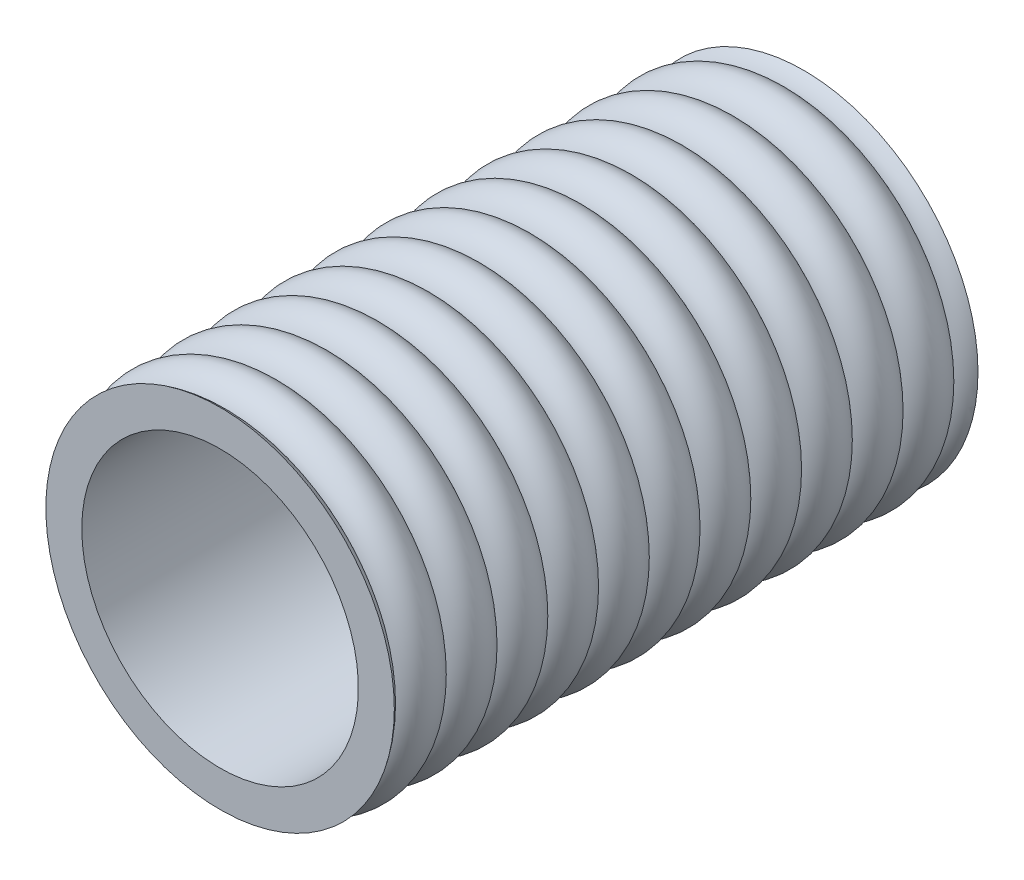
ISO-10303-21;
HEADER;
FILE_DESCRIPTION(('STEP AP214'),'2;1');
FILE_NAME('part.step','',(''),(''),'','','');
FILE_SCHEMA(('AUTOMOTIVE_DESIGN { 1 0 10303 214 1 1 1 1 }'));
ENDSEC;
DATA;
#1=APPLICATION_CONTEXT('core data for automotive mechanical design processes');
#2=APPLICATION_PROTOCOL_DEFINITION('international standard','automotive_design',2000,#1);
#3=PRODUCT_CONTEXT('',#1,'mechanical');
#4=PRODUCT('Part','Part','',(#3));
#5=PRODUCT_RELATED_PRODUCT_CATEGORY('part','',(#4));
#6=PRODUCT_DEFINITION_FORMATION('','',#4);
#7=PRODUCT_DEFINITION_CONTEXT('part definition',#1,'design');
#8=PRODUCT_DEFINITION('design','',#6,#7);
#9=PRODUCT_DEFINITION_SHAPE('','',#8);
#10=(LENGTH_UNIT() NAMED_UNIT(*) SI_UNIT(.MILLI.,.METRE.));
#11=(NAMED_UNIT(*) PLANE_ANGLE_UNIT() SI_UNIT($,.RADIAN.));
#12=(NAMED_UNIT(*) SI_UNIT($,.STERADIAN.) SOLID_ANGLE_UNIT());
#13=UNCERTAINTY_MEASURE_WITH_UNIT(LENGTH_MEASURE(1.E-05),#10,'distance_accuracy_value','');
#14=(GEOMETRIC_REPRESENTATION_CONTEXT(3) GLOBAL_UNCERTAINTY_ASSIGNED_CONTEXT((#13)) GLOBAL_UNIT_ASSIGNED_CONTEXT((#10,
#11,#12)) REPRESENTATION_CONTEXT('',''));
#15=CARTESIAN_POINT('',(0.,0.,0.));
#16=DIRECTION('',(0.,0.,1.));
#17=DIRECTION('',(1.,0.,0.));
#18=AXIS2_PLACEMENT_3D('',#15,#16,#17);
#19=CARTESIAN_POINT('',(0.,0.,15.5));
#20=DIRECTION('',(0.,0.,1.));
#21=DIRECTION('',(1.,0.,0.));
#22=AXIS2_PLACEMENT_3D('',#19,#20,#21);
#23=TOROIDAL_SURFACE('',#22,6.00000000000006,1.);
#24=CARTESIAN_POINT('',(0.,0.,16.5));
#25=DIRECTION('',(0.,0.,1.));
#26=DIRECTION('',(1.,0.,0.));
#27=AXIS2_PLACEMENT_3D('',#24,#25,#26);
#28=CIRCLE('',#27,6.);
#29=CARTESIAN_POINT('',(6.,0.,16.5));
#30=VERTEX_POINT('',#29);
#31=EDGE_CURVE('E50',#30,#30,#28,.T.);
#32=ORIENTED_EDGE('',*,*,#31,.F.);
#33=EDGE_LOOP('',(#32));
#34=FACE_BOUND('',#33,.T.);
#35=CARTESIAN_POINT('',(0.,0.,14.5));
#36=DIRECTION('',(0.,0.,1.));
#37=DIRECTION('',(1.,0.,0.));
#38=AXIS2_PLACEMENT_3D('',#35,#36,#37);
#39=CIRCLE('',#38,6.);
#40=CARTESIAN_POINT('',(6.,0.,14.5));
#41=VERTEX_POINT('',#40);
#42=EDGE_CURVE('E103',#41,#41,#39,.T.);
#43=ORIENTED_EDGE('',*,*,#42,.T.);
#44=EDGE_LOOP('',(#43));
#45=FACE_BOUND('',#44,.T.);
#46=ADVANCED_FACE('F37',(#34,#45),#23,.T.);
#47=CARTESIAN_POINT('',(0.,0.,17.5));
#48=DIRECTION('',(0.,0.,1.));
#49=DIRECTION('',(1.,0.,0.));
#50=AXIS2_PLACEMENT_3D('',#47,#48,#49);
#51=TOROIDAL_SURFACE('',#50,6.00000000000009,1.);
#52=CARTESIAN_POINT('',(0.,0.,18.5));
#53=DIRECTION('',(0.,0.,1.));
#54=DIRECTION('',(1.,0.,0.));
#55=AXIS2_PLACEMENT_3D('',#52,#53,#54);
#56=CIRCLE('',#55,6.);
#57=CARTESIAN_POINT('',(6.,0.,18.5));
#58=VERTEX_POINT('',#57);
#59=EDGE_CURVE('E55',#58,#58,#56,.T.);
#60=ORIENTED_EDGE('',*,*,#59,.F.);
#61=EDGE_LOOP('',(#60));
#62=FACE_BOUND('',#61,.T.);
#63=ORIENTED_EDGE('',*,*,#31,.T.);
#64=EDGE_LOOP('',(#63));
#65=FACE_BOUND('',#64,.T.);
#66=ADVANCED_FACE('F171',(#62,#65),#51,.T.);
#67=CARTESIAN_POINT('',(0.,0.,19.5));
#68=DIRECTION('',(0.,0.,1.));
#69=DIRECTION('',(1.,0.,0.));
#70=AXIS2_PLACEMENT_3D('',#67,#68,#69);
#71=TOROIDAL_SURFACE('',#70,6.00000000000011,0.999999999999997);
#72=CARTESIAN_POINT('',(0.,0.,20.5));
#73=DIRECTION('',(0.,0.,1.));
#74=DIRECTION('',(1.,0.,0.));
#75=AXIS2_PLACEMENT_3D('',#72,#73,#74);
#76=CIRCLE('',#75,6.);
#77=CARTESIAN_POINT('',(6.,0.,20.5));
#78=VERTEX_POINT('',#77);
#79=EDGE_CURVE('E59',#78,#78,#76,.T.);
#80=ORIENTED_EDGE('',*,*,#79,.F.);
#81=EDGE_LOOP('',(#80));
#82=FACE_BOUND('',#81,.T.);
#83=ORIENTED_EDGE('',*,*,#59,.T.);
#84=EDGE_LOOP('',(#83));
#85=FACE_BOUND('',#84,.T.);
#86=ADVANCED_FACE('F177',(#82,#85),#71,.T.);
#87=CARTESIAN_POINT('',(0.,0.,21.5));
#88=DIRECTION('',(0.,0.,1.));
#89=DIRECTION('',(1.,0.,0.));
#90=AXIS2_PLACEMENT_3D('',#87,#88,#89);
#91=TOROIDAL_SURFACE('',#90,6.00000000000014,1.);
#92=CARTESIAN_POINT('',(0.,0.,22.5));
#93=DIRECTION('',(0.,0.,1.));
#94=DIRECTION('',(1.,0.,0.));
#95=AXIS2_PLACEMENT_3D('',#92,#93,#94);
#96=CIRCLE('',#95,6.);
#97=CARTESIAN_POINT('',(6.,0.,22.5));
#98=VERTEX_POINT('',#97);
#99=EDGE_CURVE('E63',#98,#98,#96,.T.);
#100=ORIENTED_EDGE('',*,*,#99,.F.);
#101=EDGE_LOOP('',(#100));
#102=FACE_BOUND('',#101,.T.);
#103=ORIENTED_EDGE('',*,*,#79,.T.);
#104=EDGE_LOOP('',(#103));
#105=FACE_BOUND('',#104,.T.);
#106=ADVANCED_FACE('F149',(#102,#105),#91,.T.);
#107=CARTESIAN_POINT('',(0.,0.,1.5));
#108=DIRECTION('',(0.,0.,1.));
#109=DIRECTION('',(1.,0.,0.));
#110=AXIS2_PLACEMENT_3D('',#107,#108,#109);
#111=TOROIDAL_SURFACE('',#110,5.99999999999996,1.);
#112=CARTESIAN_POINT('',(0.,0.,2.5));
#113=DIRECTION('',(0.,0.,1.));
#114=DIRECTION('',(1.,0.,0.));
#115=AXIS2_PLACEMENT_3D('',#112,#113,#114);
#116=CIRCLE('',#115,5.99999999999997);
#117=CARTESIAN_POINT('',(5.99999999999997,0.,2.5));
#118=VERTEX_POINT('',#117);
#119=EDGE_CURVE('E79',#118,#118,#116,.T.);
#120=ORIENTED_EDGE('',*,*,#119,.F.);
#121=EDGE_LOOP('',(#120));
#122=FACE_BOUND('',#121,.T.);
#123=CARTESIAN_POINT('',(0.,0.,0.5));
#124=DIRECTION('',(0.,0.,1.));
#125=DIRECTION('',(1.,0.,0.));
#126=AXIS2_PLACEMENT_3D('',#123,#124,#125);
#127=CIRCLE('',#126,5.99999999999996);
#128=CARTESIAN_POINT('',(5.99999999999996,0.,0.500000000000001));
#129=VERTEX_POINT('',#128);
#130=EDGE_CURVE('E75',#129,#129,#127,.T.);
#131=ORIENTED_EDGE('',*,*,#130,.T.);
#132=EDGE_LOOP('',(#131));
#133=FACE_BOUND('',#132,.T.);
#134=ADVANCED_FACE('F143',(#122,#133),#111,.T.);
#135=CARTESIAN_POINT('',(0.,0.,3.5));
#136=DIRECTION('',(0.,0.,1.));
#137=DIRECTION('',(1.,0.,0.));
#138=AXIS2_PLACEMENT_3D('',#135,#136,#137);
#139=TOROIDAL_SURFACE('',#138,5.99999999999997,1.);
#140=CARTESIAN_POINT('',(0.,0.,4.5));
#141=DIRECTION('',(0.,0.,1.));
#142=DIRECTION('',(1.,0.,0.));
#143=AXIS2_PLACEMENT_3D('',#140,#141,#142);
#144=CIRCLE('',#143,5.99999999999998);
#145=CARTESIAN_POINT('',(5.99999999999998,0.,4.5));
#146=VERTEX_POINT('',#145);
#147=EDGE_CURVE('E83',#146,#146,#144,.T.);
#148=ORIENTED_EDGE('',*,*,#147,.F.);
#149=EDGE_LOOP('',(#148));
#150=FACE_BOUND('',#149,.T.);
#151=ORIENTED_EDGE('',*,*,#119,.T.);
#152=EDGE_LOOP('',(#151));
#153=FACE_BOUND('',#152,.T.);
#154=ADVANCED_FACE('F137',(#150,#153),#139,.T.);
#155=CARTESIAN_POINT('',(0.,0.,5.5));
#156=DIRECTION('',(0.,0.,1.));
#157=DIRECTION('',(1.,0.,0.));
#158=AXIS2_PLACEMENT_3D('',#155,#156,#157);
#159=TOROIDAL_SURFACE('',#158,5.99999999999998,1.);
#160=CARTESIAN_POINT('',(0.,0.,6.5));
#161=DIRECTION('',(0.,0.,1.));
#162=DIRECTION('',(1.,0.,0.));
#163=AXIS2_PLACEMENT_3D('',#160,#161,#162);
#164=CIRCLE('',#163,5.99999999999998);
#165=CARTESIAN_POINT('',(5.99999999999998,0.,6.5));
#166=VERTEX_POINT('',#165);
#167=EDGE_CURVE('E87',#166,#166,#164,.T.);
#168=ORIENTED_EDGE('',*,*,#167,.F.);
#169=EDGE_LOOP('',(#168));
#170=FACE_BOUND('',#169,.T.);
#171=ORIENTED_EDGE('',*,*,#147,.T.);
#172=EDGE_LOOP('',(#171));
#173=FACE_BOUND('',#172,.T.);
#174=ADVANCED_FACE('F131',(#170,#173),#159,.T.);
#175=CARTESIAN_POINT('',(0.,0.,7.5));
#176=DIRECTION('',(0.,0.,1.));
#177=DIRECTION('',(1.,0.,0.));
#178=AXIS2_PLACEMENT_3D('',#175,#176,#177);
#179=TOROIDAL_SURFACE('',#178,5.99999999999999,1.);
#180=CARTESIAN_POINT('',(0.,0.,8.5));
#181=DIRECTION('',(0.,0.,1.));
#182=DIRECTION('',(1.,0.,0.));
#183=AXIS2_PLACEMENT_3D('',#180,#181,#182);
#184=CIRCLE('',#183,5.99999999999999);
#185=CARTESIAN_POINT('',(5.99999999999999,0.,8.5));
#186=VERTEX_POINT('',#185);
#187=EDGE_CURVE('E91',#186,#186,#184,.T.);
#188=ORIENTED_EDGE('',*,*,#187,.F.);
#189=EDGE_LOOP('',(#188));
#190=FACE_BOUND('',#189,.T.);
#191=ORIENTED_EDGE('',*,*,#167,.T.);
#192=EDGE_LOOP('',(#191));
#193=FACE_BOUND('',#192,.T.);
#194=ADVANCED_FACE('F125',(#190,#193),#179,.T.);
#195=CARTESIAN_POINT('',(0.,0.,9.5));
#196=DIRECTION('',(0.,0.,1.));
#197=DIRECTION('',(1.,0.,0.));
#198=AXIS2_PLACEMENT_3D('',#195,#196,#197);
#199=TOROIDAL_SURFACE('',#198,5.99999999999999,0.999999999999999);
#200=CARTESIAN_POINT('',(0.,0.,10.5));
#201=DIRECTION('',(0.,0.,1.));
#202=DIRECTION('',(1.,0.,0.));
#203=AXIS2_PLACEMENT_3D('',#200,#201,#202);
#204=CIRCLE('',#203,6.);
#205=CARTESIAN_POINT('',(6.,0.,10.5));
#206=VERTEX_POINT('',#205);
#207=EDGE_CURVE('E95',#206,#206,#204,.T.);
#208=ORIENTED_EDGE('',*,*,#207,.F.);
#209=EDGE_LOOP('',(#208));
#210=FACE_BOUND('',#209,.T.);
#211=ORIENTED_EDGE('',*,*,#187,.T.);
#212=EDGE_LOOP('',(#211));
#213=FACE_BOUND('',#212,.T.);
#214=ADVANCED_FACE('F119',(#210,#213),#199,.T.);
#215=CARTESIAN_POINT('',(0.,0.,11.5));
#216=DIRECTION('',(0.,0.,1.));
#217=DIRECTION('',(1.,0.,0.));
#218=AXIS2_PLACEMENT_3D('',#215,#216,#217);
#219=TOROIDAL_SURFACE('',#218,6.,1.);
#220=CARTESIAN_POINT('',(0.,0.,12.5));
#221=DIRECTION('',(0.,0.,1.));
#222=DIRECTION('',(1.,0.,0.));
#223=AXIS2_PLACEMENT_3D('',#220,#221,#222);
#224=CIRCLE('',#223,6.);
#225=CARTESIAN_POINT('',(6.,0.,12.5));
#226=VERTEX_POINT('',#225);
#227=EDGE_CURVE('E99',#226,#226,#224,.T.);
#228=ORIENTED_EDGE('',*,*,#227,.F.);
#229=EDGE_LOOP('',(#228));
#230=FACE_BOUND('',#229,.T.);
#231=ORIENTED_EDGE('',*,*,#207,.T.);
#232=EDGE_LOOP('',(#231));
#233=FACE_BOUND('',#232,.T.);
#234=ADVANCED_FACE('F113',(#230,#233),#219,.T.);
#235=CARTESIAN_POINT('',(0.,0.,13.5));
#236=DIRECTION('',(0.,0.,1.));
#237=DIRECTION('',(1.,0.,0.));
#238=AXIS2_PLACEMENT_3D('',#235,#236,#237);
#239=TOROIDAL_SURFACE('',#238,6.00000000000003,0.999999999999999);
#240=ORIENTED_EDGE('',*,*,#42,.F.);
#241=EDGE_LOOP('',(#240));
#242=FACE_BOUND('',#241,.T.);
#243=ORIENTED_EDGE('',*,*,#227,.T.);
#244=EDGE_LOOP('',(#243));
#245=FACE_BOUND('',#244,.T.);
#246=ADVANCED_FACE('F109',(#242,#245),#239,.T.);
#247=CARTESIAN_POINT('',(0.,0.,23.5));
#248=DIRECTION('',(0.,0.,1.));
#249=DIRECTION('',(1.,0.,0.));
#250=AXIS2_PLACEMENT_3D('',#247,#248,#249);
#251=TOROIDAL_SURFACE('',#250,6.00000000000017,1.);
#252=CARTESIAN_POINT('',(0.,0.,23.));
#253=DIRECTION('',(0.,0.,1.));
#254=DIRECTION('',(1.,0.,0.));
#255=AXIS2_PLACEMENT_3D('',#252,#253,#254);
#256=CIRCLE('',#255,6.86602540378461);
#257=CARTESIAN_POINT('',(6.86602540378461,0.,23.));
#258=VERTEX_POINT('',#257);
#259=EDGE_CURVE('E67',#258,#258,#256,.T.);
#260=ORIENTED_EDGE('',*,*,#259,.F.);
#261=EDGE_LOOP('',(#260));
#262=FACE_BOUND('',#261,.T.);
#263=ORIENTED_EDGE('',*,*,#99,.T.);
#264=EDGE_LOOP('',(#263));
#265=FACE_BOUND('',#264,.T.);
#266=ADVANCED_FACE('F112',(#262,#265),#251,.T.);
#267=CARTESIAN_POINT('',(0.,0.,-0.5));
#268=DIRECTION('',(0.,0.,1.));
#269=DIRECTION('',(1.,0.,0.));
#270=AXIS2_PLACEMENT_3D('',#267,#268,#269);
#271=TOROIDAL_SURFACE('',#270,5.99999999999996,1.);
#272=ORIENTED_EDGE('',*,*,#130,.F.);
#273=EDGE_LOOP('',(#272));
#274=FACE_BOUND('',#273,.T.);
#275=CARTESIAN_POINT('',(0.,0.,0.));
#276=DIRECTION('',(0.,0.,1.));
#277=DIRECTION('',(1.,0.,0.));
#278=AXIS2_PLACEMENT_3D('',#275,#276,#277);
#279=CIRCLE('',#278,6.8660254037844);
#280=CARTESIAN_POINT('',(6.8660254037844,0.,0.));
#281=VERTEX_POINT('',#280);
#282=EDGE_CURVE('E71',#281,#281,#279,.T.);
#283=ORIENTED_EDGE('',*,*,#282,.T.);
#284=EDGE_LOOP('',(#283));
#285=FACE_BOUND('',#284,.T.);
#286=ADVANCED_FACE('F153',(#274,#285),#271,.T.);
#287=CARTESIAN_POINT('',(0.,0.,23.));
#288=DIRECTION('',(0.,0.,1.));
#289=DIRECTION('',(1.,0.,0.));
#290=AXIS2_PLACEMENT_3D('',#287,#288,#289);
#291=PLANE('',#290);
#292=CARTESIAN_POINT('',(0.,0.,23.));
#293=DIRECTION('',(0.,0.,-1.));
#294=DIRECTION('',(-1.,0.,0.));
#295=AXIS2_PLACEMENT_3D('',#292,#293,#294);
#296=CIRCLE('',#295,5.45);
#297=CARTESIAN_POINT('',(-5.45,0.,23.));
#298=VERTEX_POINT('',#297);
#299=EDGE_CURVE('E10',#298,#298,#296,.T.);
#300=ORIENTED_EDGE('',*,*,#299,.T.);
#301=EDGE_LOOP('',(#300));
#302=FACE_BOUND('',#301,.T.);
#303=ORIENTED_EDGE('',*,*,#259,.T.);
#304=EDGE_LOOP('',(#303));
#305=FACE_BOUND('',#304,.T.);
#306=ADVANCED_FACE('F156',(#302,#305),#291,.T.);
#307=CARTESIAN_POINT('',(0.,0.,0.));
#308=DIRECTION('',(0.,0.,1.));
#309=DIRECTION('',(1.,0.,0.));
#310=AXIS2_PLACEMENT_3D('',#307,#308,#309);
#311=PLANE('',#310);
#312=CARTESIAN_POINT('',(0.,0.,0.));
#313=DIRECTION('',(0.,0.,-1.));
#314=DIRECTION('',(-1.,0.,0.));
#315=AXIS2_PLACEMENT_3D('',#312,#313,#314);
#316=CIRCLE('',#315,5.45);
#317=CARTESIAN_POINT('',(-5.45,0.,0.));
#318=VERTEX_POINT('',#317);
#319=EDGE_CURVE('E41',#318,#318,#316,.T.);
#320=ORIENTED_EDGE('',*,*,#319,.F.);
#321=EDGE_LOOP('',(#320));
#322=FACE_BOUND('',#321,.T.);
#323=ORIENTED_EDGE('',*,*,#282,.F.);
#324=EDGE_LOOP('',(#323));
#325=FACE_BOUND('',#324,.T.);
#326=ADVANCED_FACE('F39',(#322,#325),#311,.F.);
#327=CARTESIAN_POINT('',(0.,0.,23.));
#328=DIRECTION('',(0.,0.,-1.));
#329=DIRECTION('',(-1.,0.,0.));
#330=AXIS2_PLACEMENT_3D('',#327,#328,#329);
#331=CYLINDRICAL_SURFACE('',#330,5.45);
#332=ORIENTED_EDGE('',*,*,#299,.F.);
#333=EDGE_LOOP('',(#332));
#334=FACE_BOUND('',#333,.T.);
#335=ORIENTED_EDGE('',*,*,#319,.T.);
#336=EDGE_LOOP('',(#335));
#337=FACE_BOUND('',#336,.T.);
#338=ADVANCED_FACE('F161',(#334,#337),#331,.F.);
#339=CLOSED_SHELL('',(#46,#66,#86,#106,#134,#154,#174,#194,#214,#234,#246,#266,#286,#306,#326,#338));
#340=MANIFOLD_SOLID_BREP('B2',#339);
#341=ADVANCED_BREP_SHAPE_REPRESENTATION('',(#18,#340),#14);
#342=SHAPE_DEFINITION_REPRESENTATION(#9,#341);
ENDSEC;
END-ISO-10303-21;
